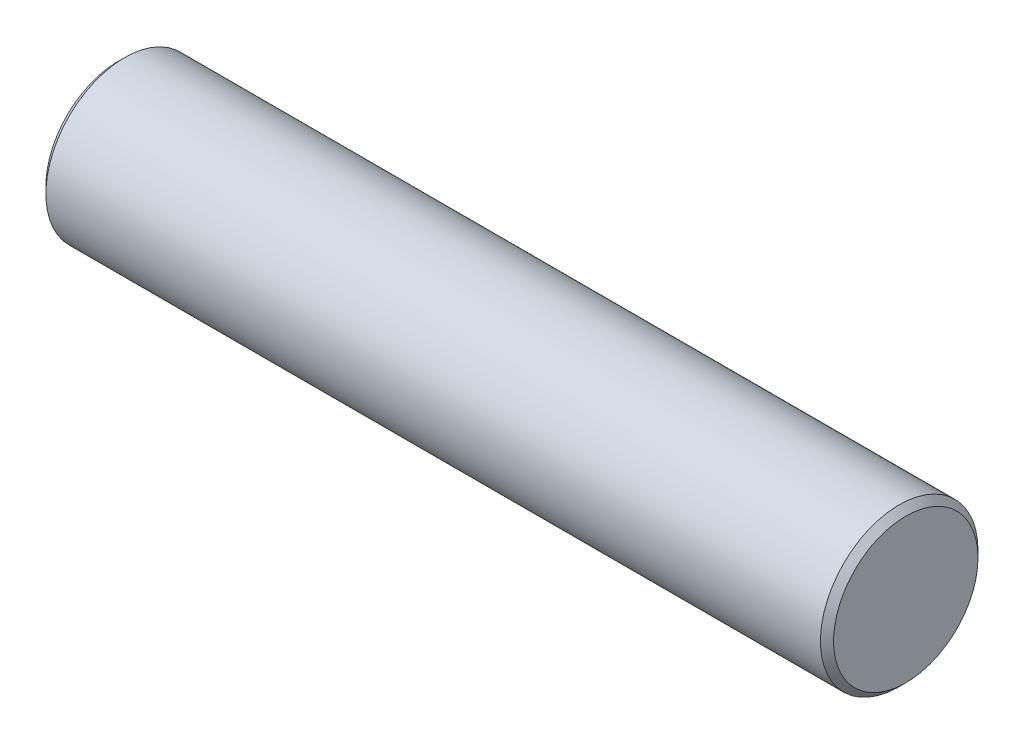
ISO-10303-21;
HEADER;
FILE_DESCRIPTION(('STEP AP214'),'2;1');
FILE_NAME('part.step','',(''),(''),'','','');
FILE_SCHEMA(('AUTOMOTIVE_DESIGN { 1 0 10303 214 1 1 1 1 }'));
ENDSEC;
DATA;
#1=APPLICATION_CONTEXT('core data for automotive mechanical design processes');
#2=APPLICATION_PROTOCOL_DEFINITION('international standard','automotive_design',2000,#1);
#3=PRODUCT_CONTEXT('',#1,'mechanical');
#4=PRODUCT('Part','Part','',(#3));
#5=PRODUCT_RELATED_PRODUCT_CATEGORY('part','',(#4));
#6=PRODUCT_DEFINITION_FORMATION('','',#4);
#7=PRODUCT_DEFINITION_CONTEXT('part definition',#1,'design');
#8=PRODUCT_DEFINITION('design','',#6,#7);
#9=PRODUCT_DEFINITION_SHAPE('','',#8);
#10=(LENGTH_UNIT() NAMED_UNIT(*) SI_UNIT(.MILLI.,.METRE.));
#11=(NAMED_UNIT(*) PLANE_ANGLE_UNIT() SI_UNIT($,.RADIAN.));
#12=(NAMED_UNIT(*) SI_UNIT($,.STERADIAN.) SOLID_ANGLE_UNIT());
#13=UNCERTAINTY_MEASURE_WITH_UNIT(LENGTH_MEASURE(1.E-05),#10,'distance_accuracy_value','');
#14=(GEOMETRIC_REPRESENTATION_CONTEXT(3) GLOBAL_UNCERTAINTY_ASSIGNED_CONTEXT((#13)) GLOBAL_UNIT_ASSIGNED_CONTEXT((#10,
#11,#12)) REPRESENTATION_CONTEXT('',''));
#15=CARTESIAN_POINT('',(0.,0.,0.));
#16=DIRECTION('',(0.,0.,1.));
#17=DIRECTION('',(1.,0.,0.));
#18=AXIS2_PLACEMENT_3D('',#15,#16,#17);
#19=CARTESIAN_POINT('',(7.5,0.,0.));
#20=DIRECTION('',(-1.,0.,0.));
#21=DIRECTION('',(0.,0.,1.));
#22=AXIS2_PLACEMENT_3D('',#19,#20,#21);
#23=CYLINDRICAL_SURFACE('',#22,1.5);
#24=CARTESIAN_POINT('',(-7.375,0.,0.));
#25=DIRECTION('',(1.,0.,0.));
#26=DIRECTION('',(0.,0.,-1.));
#27=AXIS2_PLACEMENT_3D('',#24,#25,#26);
#28=CIRCLE('',#27,1.5);
#29=CARTESIAN_POINT('',(-7.375,0.,-1.5));
#30=VERTEX_POINT('',#29);
#31=EDGE_CURVE('E49',#30,#30,#28,.T.);
#32=ORIENTED_EDGE('',*,*,#31,.T.);
#33=EDGE_LOOP('',(#32));
#34=FACE_BOUND('',#33,.T.);
#35=CARTESIAN_POINT('',(7.375,0.,0.));
#36=DIRECTION('',(1.,0.,0.));
#37=DIRECTION('',(0.,0.,-1.));
#38=AXIS2_PLACEMENT_3D('',#35,#36,#37);
#39=CIRCLE('',#38,1.5);
#40=CARTESIAN_POINT('',(7.375,0.,-1.5));
#41=VERTEX_POINT('',#40);
#42=EDGE_CURVE('E53',#41,#41,#39,.F.);
#43=ORIENTED_EDGE('',*,*,#42,.T.);
#44=EDGE_LOOP('',(#43));
#45=FACE_BOUND('',#44,.T.);
#46=ADVANCED_FACE('F37',(#34,#45),#23,.T.);
#47=CARTESIAN_POINT('',(7.5,0.,0.));
#48=DIRECTION('',(1.,0.,0.));
#49=DIRECTION('',(0.,0.,-1.));
#50=AXIS2_PLACEMENT_3D('',#47,#48,#49);
#51=PLANE('',#50);
#52=CARTESIAN_POINT('',(7.5,0.,0.));
#53=DIRECTION('',(1.,0.,0.));
#54=DIRECTION('',(0.,0.,-1.));
#55=AXIS2_PLACEMENT_3D('',#52,#53,#54);
#56=CIRCLE('',#55,1.375);
#57=CARTESIAN_POINT('',(7.5,0.,-1.375));
#58=VERTEX_POINT('',#57);
#59=EDGE_CURVE('E10',#58,#58,#56,.T.);
#60=ORIENTED_EDGE('',*,*,#59,.T.);
#61=EDGE_LOOP('',(#60));
#62=FACE_BOUND('',#61,.T.);
#63=ADVANCED_FACE('F69',(#62),#51,.T.);
#64=CARTESIAN_POINT('',(-7.5,0.,0.));
#65=DIRECTION('',(1.,0.,0.));
#66=DIRECTION('',(0.,0.,-1.));
#67=AXIS2_PLACEMENT_3D('',#64,#65,#66);
#68=PLANE('',#67);
#69=CARTESIAN_POINT('',(-7.5,0.,0.));
#70=DIRECTION('',(1.,0.,0.));
#71=DIRECTION('',(0.,0.,-1.));
#72=AXIS2_PLACEMENT_3D('',#69,#70,#71);
#73=CIRCLE('',#72,1.375);
#74=CARTESIAN_POINT('',(-7.5,0.,-1.375));
#75=VERTEX_POINT('',#74);
#76=EDGE_CURVE('E45',#75,#75,#73,.F.);
#77=ORIENTED_EDGE('',*,*,#76,.T.);
#78=EDGE_LOOP('',(#77));
#79=FACE_BOUND('',#78,.T.);
#80=ADVANCED_FACE('F66',(#79),#68,.F.);
#81=CARTESIAN_POINT('',(-7.375,0.,0.));
#82=DIRECTION('',(1.,0.,0.));
#83=DIRECTION('',(0.,0.,-1.));
#84=AXIS2_PLACEMENT_3D('',#81,#82,#83);
#85=CONICAL_SURFACE('',#84,1.5,0.785398163397449);
#86=ORIENTED_EDGE('',*,*,#76,.F.);
#87=EDGE_LOOP('',(#86));
#88=FACE_BOUND('',#87,.T.);
#89=ORIENTED_EDGE('',*,*,#31,.F.);
#90=EDGE_LOOP('',(#89));
#91=FACE_BOUND('',#90,.T.);
#92=ADVANCED_FACE('F62',(#88,#91),#85,.T.);
#93=CARTESIAN_POINT('',(7.5,0.,0.));
#94=DIRECTION('',(-1.,0.,0.));
#95=DIRECTION('',(0.,0.,1.));
#96=AXIS2_PLACEMENT_3D('',#93,#94,#95);
#97=CONICAL_SURFACE('',#96,1.375,0.785398163397449);
#98=ORIENTED_EDGE('',*,*,#42,.F.);
#99=EDGE_LOOP('',(#98));
#100=FACE_BOUND('',#99,.T.);
#101=ORIENTED_EDGE('',*,*,#59,.F.);
#102=EDGE_LOOP('',(#101));
#103=FACE_BOUND('',#102,.T.);
#104=ADVANCED_FACE('F40',(#100,#103),#97,.T.);
#105=CLOSED_SHELL('',(#46,#63,#80,#92,#104));
#106=MANIFOLD_SOLID_BREP('B2',#105);
#107=ADVANCED_BREP_SHAPE_REPRESENTATION('',(#18,#106),#14);
#108=SHAPE_DEFINITION_REPRESENTATION(#9,#107);
ENDSEC;
END-ISO-10303-21;
